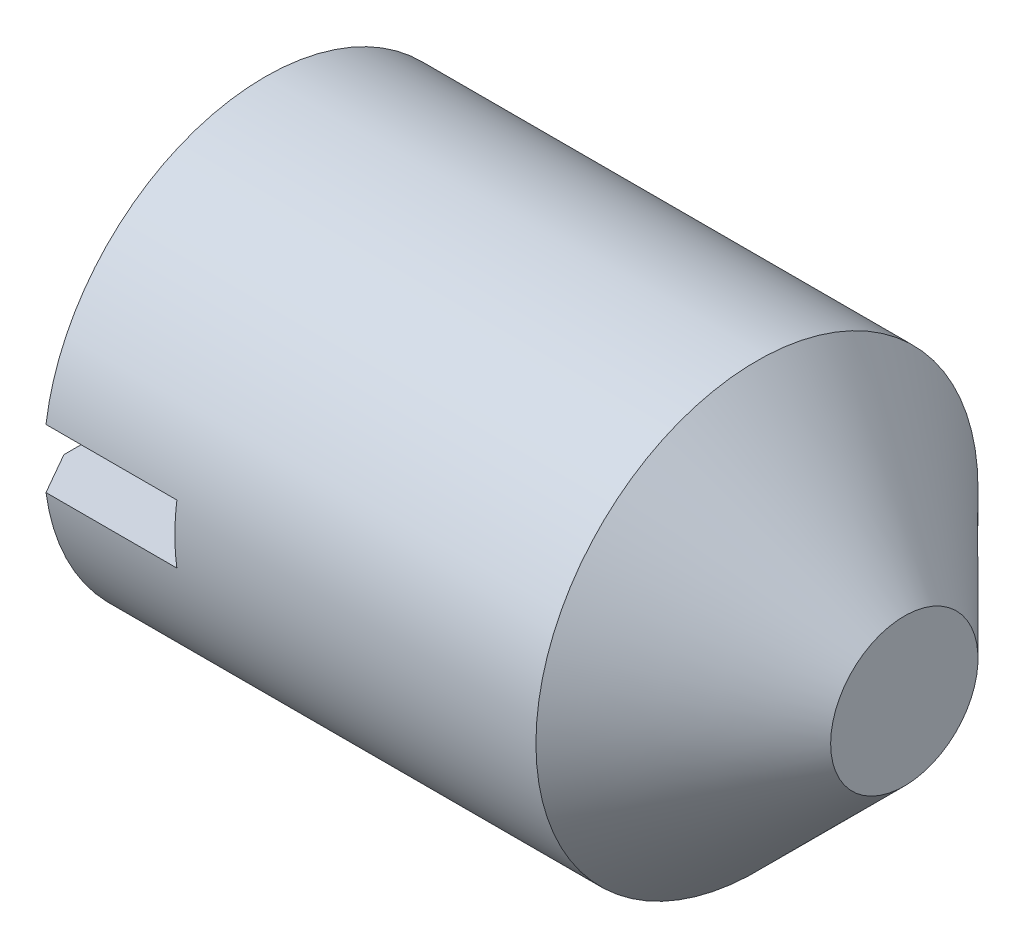
ISO-10303-21;
HEADER;
FILE_DESCRIPTION(('STEP AP214'),'2;1');
FILE_NAME('part.step','',(''),(''),'','','');
FILE_SCHEMA(('AUTOMOTIVE_DESIGN { 1 0 10303 214 1 1 1 1 }'));
ENDSEC;
DATA;
#1=APPLICATION_CONTEXT('core data for automotive mechanical design processes');
#2=APPLICATION_PROTOCOL_DEFINITION('international standard','automotive_design',2000,#1);
#3=PRODUCT_CONTEXT('',#1,'mechanical');
#4=PRODUCT('Part','Part','',(#3));
#5=PRODUCT_RELATED_PRODUCT_CATEGORY('part','',(#4));
#6=PRODUCT_DEFINITION_FORMATION('','',#4);
#7=PRODUCT_DEFINITION_CONTEXT('part definition',#1,'design');
#8=PRODUCT_DEFINITION('design','',#6,#7);
#9=PRODUCT_DEFINITION_SHAPE('','',#8);
#10=(LENGTH_UNIT() NAMED_UNIT(*) SI_UNIT(.MILLI.,.METRE.));
#11=(NAMED_UNIT(*) PLANE_ANGLE_UNIT() SI_UNIT($,.RADIAN.));
#12=(NAMED_UNIT(*) SI_UNIT($,.STERADIAN.) SOLID_ANGLE_UNIT());
#13=UNCERTAINTY_MEASURE_WITH_UNIT(LENGTH_MEASURE(1.E-05),#10,'distance_accuracy_value','');
#14=(GEOMETRIC_REPRESENTATION_CONTEXT(3) GLOBAL_UNCERTAINTY_ASSIGNED_CONTEXT((#13)) GLOBAL_UNIT_ASSIGNED_CONTEXT((#10,
#11,#12)) REPRESENTATION_CONTEXT('',''));
#15=CARTESIAN_POINT('',(0.,0.,0.));
#16=DIRECTION('',(0.,0.,1.));
#17=DIRECTION('',(1.,0.,0.));
#18=AXIS2_PLACEMENT_3D('',#15,#16,#17);
#19=CARTESIAN_POINT('',(0.,0.,0.));
#20=DIRECTION('',(-1.,0.,0.));
#21=DIRECTION('',(0.,0.,1.));
#22=AXIS2_PLACEMENT_3D('',#19,#20,#21);
#23=PLANE('',#22);
#24=CARTESIAN_POINT('',(0.,0.,0.));
#25=DIRECTION('',(-1.,0.,0.));
#26=DIRECTION('',(0.,0.,1.));
#27=AXIS2_PLACEMENT_3D('',#24,#25,#26);
#28=CIRCLE('',#27,1.2195);
#29=CARTESIAN_POINT('',(0.,-0.2,-1.20298805064722));
#30=VERTEX_POINT('',#29);
#31=CARTESIAN_POINT('',(0.,-0.2,1.20298805064722));
#32=VERTEX_POINT('',#31);
#33=EDGE_CURVE('E158',#30,#32,#28,.T.);
#34=ORIENTED_EDGE('',*,*,#33,.T.);
#35=DIRECTION('',(0.,0.,-1.));
#36=VECTOR('',#35,1.);
#37=CARTESIAN_POINT('',(0.,-0.2,1.5));
#38=LINE('',#37,#36);
#39=EDGE_CURVE('E113',#32,#30,#38,.T.);
#40=ORIENTED_EDGE('',*,*,#39,.T.);
#41=EDGE_LOOP('',(#34,#40));
#42=FACE_BOUND('',#41,.T.);
#43=ADVANCED_FACE('F37',(#42),#23,.T.);
#44=CARTESIAN_POINT('',(0.,0.,0.));
#45=DIRECTION('',(1.,0.,0.));
#46=DIRECTION('',(0.,0.,-1.));
#47=AXIS2_PLACEMENT_3D('',#44,#45,#46);
#48=CONICAL_SURFACE('',#47,1.2195,1.0471975511966);
#49=CARTESIAN_POINT('',(0.161946750507689,0.,0.));
#50=DIRECTION('',(-1.,0.,0.));
#51=DIRECTION('',(0.,0.,1.));
#52=AXIS2_PLACEMENT_3D('',#49,#50,#51);
#53=CIRCLE('',#52,1.5);
#54=CARTESIAN_POINT('',(0.161946750507689,-0.2,-1.48660687473185));
#55=VERTEX_POINT('',#54);
#56=CARTESIAN_POINT('',(0.161946750507689,-0.2,1.48660687473185));
#57=VERTEX_POINT('',#56);
#58=EDGE_CURVE('E163',#55,#57,#53,.T.);
#59=ORIENTED_EDGE('',*,*,#58,.T.);
#60=CARTESIAN_POINT('',(1.20629871080809,-0.2,3.30282076710549));
#61=CARTESIAN_POINT('',(1.1258848340686,-0.2,3.16328868098317));
#62=CARTESIAN_POINT('',(1.04548683646851,-0.2,3.02374748435471));
#63=CARTESIAN_POINT('',(0.884734685695384,-0.2,2.74464220536906));
#64=CARTESIAN_POINT('',(0.804380531977208,-0.2,2.60507812332584));
#65=CARTESIAN_POINT('',(0.563532322366071,-0.2,2.18657107206695));
#66=CARTESIAN_POINT('',(0.403118911408213,-0.2,1.90758155197264));
#67=CARTESIAN_POINT('',(0.203453091691774,-0.2,1.5591352689348));
#68=CARTESIAN_POINT('',(0.163813882961552,-0.2,1.48990028566118));
#69=CARTESIAN_POINT('',(0.0846214376710577,-0.2,1.35138417690048));
#70=CARTESIAN_POINT('',(0.045068198345437,-0.2,1.28210305299411));
#71=CARTESIAN_POINT('',(-0.0339277829048346,-0.2,1.14343154297904));
#72=CARTESIAN_POINT('',(-0.0733704592736069,-0.2,1.07404111944853));
#73=CARTESIAN_POINT('',(-0.15203026909522,-0.2,0.935122728971882));
#74=CARTESIAN_POINT('',(-0.191247377446437,-0.2,0.865594747832418));
#75=CARTESIAN_POINT('',(-0.269243442471656,-0.2,0.726327139109901));
#76=CARTESIAN_POINT('',(-0.308022564599071,-0.2,0.656587604996075));
#77=CARTESIAN_POINT('',(-0.365406927388352,-0.2,0.551558419317487));
#78=CARTESIAN_POINT('',(-0.384402406747344,-0.2,0.516482354594956));
#79=CARTESIAN_POINT('',(-0.421939923343245,-0.2,0.446089095801925));
#80=CARTESIAN_POINT('',(-0.440481991858611,-0.2,0.410771918580754));
#81=CARTESIAN_POINT('',(-0.467570677276347,-0.2,0.357595954007422));
#82=CARTESIAN_POINT('',(-0.476446721470345,-0.2,0.339905715546129));
#83=CARTESIAN_POINT('',(-0.493880874270408,-0.2,0.304364854504957));
#84=CARTESIAN_POINT('',(-0.502438924314328,-0.2,0.286514203127592));
#85=CARTESIAN_POINT('',(-0.519111988348972,-0.2,0.250508624654329));
#86=CARTESIAN_POINT('',(-0.527224910669282,-0.2,0.232352711011916));
#87=CARTESIAN_POINT('',(-0.54267790480467,-0.2,0.19572240226908));
#88=CARTESIAN_POINT('',(-0.550018195419213,-0.2,0.177248099066487));
#89=CARTESIAN_POINT('',(-0.565098059089181,-0.2,0.135214956292505));
#90=CARTESIAN_POINT('',(-0.572493338222675,-0.2,0.111521210196341));
#91=CARTESIAN_POINT('',(-0.580822315665492,-0.2,0.07545910853772));
#92=CARTESIAN_POINT('',(-0.583132873034638,-0.2,0.0634171537683038));
#93=CARTESIAN_POINT('',(-0.586609682213143,-0.2,0.0391732027075515));
#94=CARTESIAN_POINT('',(-0.587776935636715,-0.2,0.0269713560082879));
#95=CARTESIAN_POINT('',(-0.588820399014832,-0.2,0.00235568432887118));
#96=CARTESIAN_POINT('',(-0.588680137589163,-0.2,-0.010058873041522));
#97=CARTESIAN_POINT('',(-0.587089134244066,-0.2,-0.0348030961807394));
#98=CARTESIAN_POINT('',(-0.585638036534471,-0.2,-0.0471327379860356));
#99=CARTESIAN_POINT('',(-0.58159657218101,-0.2,-0.0717422859516815));
#100=CARTESIAN_POINT('',(-0.578993313922486,-0.2,-0.0840199950000165));
#101=CARTESIAN_POINT('',(-0.572904496311251,-0.2,-0.108351491101818));
#102=CARTESIAN_POINT('',(-0.569418710259527,-0.2,-0.120405219765151));
#103=CARTESIAN_POINT('',(-0.558447756238564,-0.2,-0.154857563867093));
#104=CARTESIAN_POINT('',(-0.550148968967213,-0.2,-0.17699252479426));
#105=CARTESIAN_POINT('',(-0.532322566219249,-0.2,-0.220768284226168));
#106=CARTESIAN_POINT('',(-0.522793484124285,-0.2,-0.242408456061966));
#107=CARTESIAN_POINT('',(-0.503003702579483,-0.2,-0.285415171147094));
#108=CARTESIAN_POINT('',(-0.492741238236355,-0.2,-0.306780897636912));
#109=CARTESIAN_POINT('',(-0.471779741367672,-0.2,-0.349298039322649));
#110=CARTESIAN_POINT('',(-0.461080654322906,-0.2,-0.370449427340883));
#111=CARTESIAN_POINT('',(-0.428496574582122,-0.2,-0.433836679537895));
#112=CARTESIAN_POINT('',(-0.406195821669475,-0.2,-0.475858043428755));
#113=CARTESIAN_POINT('',(-0.361115816189636,-0.2,-0.559540216113808));
#114=CARTESIAN_POINT('',(-0.338337517348818,-0.2,-0.601201545247628));
#115=CARTESIAN_POINT('',(-0.270113974050485,-0.2,-0.724978344281511));
#116=CARTESIAN_POINT('',(-0.224257059193257,-0.2,-0.806866708769459));
#117=CARTESIAN_POINT('',(-0.13212296028641,-0.2,-0.970408279374785));
#118=CARTESIAN_POINT('',(-0.0858457617209846,-0.2,-1.05206147724068));
#119=CARTESIAN_POINT('',(0.00696526589570302,-0.2,-1.21530054146956));
#120=CARTESIAN_POINT('',(0.0534992567625489,-0.2,-1.29688631601694));
#121=CARTESIAN_POINT('',(0.146690772784196,-0.2,-1.45998572685143));
#122=CARTESIAN_POINT('',(0.193348296331444,-0.2,-1.54149936405903));
#123=CARTESIAN_POINT('',(0.333088075414018,-0.2,-1.7853708564847));
#124=CARTESIAN_POINT('',(0.426282731775801,-0.2,-1.94766431380805));
#125=CARTESIAN_POINT('',(0.612788531876208,-0.2,-2.27214409768562));
#126=CARTESIAN_POINT('',(0.706099650769755,-0.2,-2.43433043853729));
#127=CARTESIAN_POINT('',(0.833307210297042,-0.2,-2.6553127645961));
#128=CARTESIAN_POINT('',(0.867170527933347,-0.200000000000001,-2.71412781150969));
#129=CARTESIAN_POINT('',(0.934906863459935,-0.200000000000001,-2.8317553866576));
#130=CARTESIAN_POINT('',(0.968779881678241,-0.200000000000001,-2.89056791470299));
#131=CARTESIAN_POINT('',(1.03659117667008,-0.200000000000001,-3.00829025510179));
#132=CARTESIAN_POINT('',(1.07052946537539,-0.200000000000001,-3.06720006058222));
#133=CARTESIAN_POINT('',(1.13841060073561,-0.200000000000001,-3.18501396406719));
#134=CARTESIAN_POINT('',(1.17235344715919,-0.200000000000001,-3.24391806220502));
#135=CARTESIAN_POINT('',(1.20629871080809,-0.200000000000001,-3.30282076710549));
#136=B_SPLINE_CURVE_WITH_KNOTS('',3,(#60,#61,#62,#63,#64,#65,#66,#67,#68,#69,#70,#71,#72,#73,
#74,#75,#76,#77,#78,#79,#80,#81,#82,#83,#84,#85,#86,#87,#88,#89,#90,#91,#92,#93,#94,#95,#96,#97,
#98,#99,#100,#101,#102,#103,#104,#105,#106,#107,#108,#109,#110,#111,#112,#113,#114,#115,#116,
#117,#118,#119,#120,#121,#122,#123,#124,#125,#126,#127,#128,#129,#130,#131,#132,#133,#134,#135),
.UNSPECIFIED.,.F.,.F.,(4,2,2,2,2,2,2,2,2,2,2,2,2,2,2,2,2,2,2,2,2,2,2,2,2,2,2,2,2,2,2,2,2,2,2,2,
2,4),(0.,0.483135881915182,0.966265613214854,1.93172257219434,2.17106066670211,2.41039094505958,
2.64984155615903,2.88931831730882,3.12870136566746,3.24836817227011,3.36802670025883,
3.42740075919355,3.48678569886581,3.5464292526316,3.6060558704016,3.68031927125071,
3.7170606614476,3.75376983475058,3.79094206959469,3.82812439684383,3.86573371330642,
3.90335270046815,3.97418935604331,4.04511124851304,4.11620996946988,4.18731759554776,
4.33002406930204,4.47246852696984,4.7540250366574,5.03559130803863,5.31736183818689,
5.5991287194502,6.16057277780873,6.72191257749192,6.92551367152995,7.12912274116123,
7.33308242695802,7.5370341031328),.UNSPECIFIED.);
#137=EDGE_CURVE('E58',#57,#32,#136,.T.);
#138=ORIENTED_EDGE('',*,*,#137,.T.);
#139=ORIENTED_EDGE('',*,*,#33,.F.);
#140=EDGE_CURVE('E169',#30,#55,#136,.T.);
#141=ORIENTED_EDGE('',*,*,#140,.T.);
#142=EDGE_LOOP('',(#59,#138,#139,#141));
#143=FACE_BOUND('',#142,.T.);
#144=ADVANCED_FACE('F142',(#143),#48,.T.);
#145=CARTESIAN_POINT('',(-12.7,0.,0.));
#146=DIRECTION('',(-1.,0.,0.));
#147=DIRECTION('',(0.,0.,1.));
#148=AXIS2_PLACEMENT_3D('',#145,#146,#147);
#149=CYLINDRICAL_SURFACE('',#148,1.5);
#150=CARTESIAN_POINT('',(3.5,0.,0.));
#151=DIRECTION('',(-1.,0.,0.));
#152=DIRECTION('',(0.,0.,1.));
#153=AXIS2_PLACEMENT_3D('',#150,#151,#152);
#154=CIRCLE('',#153,1.5);
#155=CARTESIAN_POINT('',(3.5,0.,1.5));
#156=VERTEX_POINT('',#155);
#157=EDGE_CURVE('E168',#156,#156,#154,.T.);
#158=ORIENTED_EDGE('',*,*,#157,.T.);
#159=EDGE_LOOP('',(#158));
#160=FACE_BOUND('',#159,.T.);
#161=ORIENTED_EDGE('',*,*,#58,.F.);
#162=DIRECTION('',(-1.,0.,0.));
#163=VECTOR('',#162,1.);
#164=CARTESIAN_POINT('',(-12.7,-0.2,-1.48660687473185));
#165=LINE('',#164,#163);
#166=CARTESIAN_POINT('',(1.05,-0.2,-1.48660687473185));
#167=VERTEX_POINT('',#166);
#168=EDGE_CURVE('E11',#55,#167,#165,.F.);
#169=ORIENTED_EDGE('',*,*,#168,.T.);
#170=CARTESIAN_POINT('',(1.05,0.,0.));
#171=DIRECTION('',(-1.,0.,0.));
#172=DIRECTION('',(0.,0.,1.));
#173=AXIS2_PLACEMENT_3D('',#170,#171,#172);
#174=CIRCLE('',#173,1.5);
#175=CARTESIAN_POINT('',(1.05,0.2,-1.48660687473185));
#176=VERTEX_POINT('',#175);
#177=EDGE_CURVE('E102',#167,#176,#174,.F.);
#178=ORIENTED_EDGE('',*,*,#177,.T.);
#179=DIRECTION('',(-1.,0.,0.));
#180=VECTOR('',#179,1.);
#181=CARTESIAN_POINT('',(-12.7,0.2,-1.48660687473185));
#182=LINE('',#181,#180);
#183=CARTESIAN_POINT('',(0.161946750507689,0.2,-1.48660687473185));
#184=VERTEX_POINT('',#183);
#185=EDGE_CURVE('E46',#184,#176,#182,.F.);
#186=ORIENTED_EDGE('',*,*,#185,.F.);
#187=CARTESIAN_POINT('',(0.161946750507689,0.2,1.48660687473185));
#188=VERTEX_POINT('',#187);
#189=EDGE_CURVE('E159',#188,#184,#53,.T.);
#190=ORIENTED_EDGE('',*,*,#189,.F.);
#191=DIRECTION('',(-1.,0.,0.));
#192=VECTOR('',#191,1.);
#193=CARTESIAN_POINT('',(-12.7,0.2,1.48660687473185));
#194=LINE('',#193,#192);
#195=CARTESIAN_POINT('',(1.05,0.2,1.48660687473185));
#196=VERTEX_POINT('',#195);
#197=EDGE_CURVE('E95',#196,#188,#194,.T.);
#198=ORIENTED_EDGE('',*,*,#197,.F.);
#199=CARTESIAN_POINT('',(1.05,-0.2,1.48660687473185));
#200=VERTEX_POINT('',#199);
#201=EDGE_CURVE('E89',#196,#200,#174,.F.);
#202=ORIENTED_EDGE('',*,*,#201,.T.);
#203=DIRECTION('',(-1.,0.,0.));
#204=VECTOR('',#203,1.);
#205=CARTESIAN_POINT('',(-12.7,-0.2,1.48660687473185));
#206=LINE('',#205,#204);
#207=EDGE_CURVE('E92',#200,#57,#206,.T.);
#208=ORIENTED_EDGE('',*,*,#207,.T.);
#209=EDGE_LOOP('',(#161,#169,#178,#186,#190,#198,#202,#208));
#210=FACE_BOUND('',#209,.T.);
#211=ADVANCED_FACE('F91',(#160,#210),#149,.T.);
#212=DIRECTION('',(0.,0.,-1.));
#213=VECTOR('',#212,1.);
#214=CARTESIAN_POINT('',(0.,0.2,1.5));
#215=LINE('',#214,#213);
#216=CARTESIAN_POINT('',(0.,0.2,1.20298805064722));
#217=VERTEX_POINT('',#216);
#218=CARTESIAN_POINT('',(0.,0.2,-1.20298805064722));
#219=VERTEX_POINT('',#218);
#220=EDGE_CURVE('E173',#217,#219,#215,.T.);
#221=ORIENTED_EDGE('',*,*,#220,.F.);
#222=EDGE_CURVE('E100',#217,#219,#28,.T.);
#223=ORIENTED_EDGE('',*,*,#222,.T.);
#224=EDGE_LOOP('',(#221,#223));
#225=FACE_BOUND('',#224,.T.);
#226=ADVANCED_FACE('F39',(#225),#23,.T.);
#227=CARTESIAN_POINT('',(1.20629871080809,0.2,3.30282076710549));
#228=CARTESIAN_POINT('',(1.1258848340686,0.2,3.16328868098317));
#229=CARTESIAN_POINT('',(1.04548683646851,0.2,3.02374748435471));
#230=CARTESIAN_POINT('',(0.884734685695383,0.2,2.74464220536906));
#231=CARTESIAN_POINT('',(0.804380531977208,0.2,2.60507812332584));
#232=CARTESIAN_POINT('',(0.563532322366071,0.2,2.18657107206695));
#233=CARTESIAN_POINT('',(0.403118911408213,0.2,1.90758155197264));
#234=CARTESIAN_POINT('',(0.203453091691774,0.2,1.5591352689348));
#235=CARTESIAN_POINT('',(0.163813882961552,0.2,1.48990028566118));
#236=CARTESIAN_POINT('',(0.0846214376710577,0.2,1.35138417690048));
#237=CARTESIAN_POINT('',(0.0450681983454369,0.2,1.28210305299411));
#238=CARTESIAN_POINT('',(-0.0339277829048347,0.2,1.14343154297904));
#239=CARTESIAN_POINT('',(-0.073370459273607,0.2,1.07404111944853));
#240=CARTESIAN_POINT('',(-0.152030269095221,0.2,0.935122728971882));
#241=CARTESIAN_POINT('',(-0.191247377446437,0.2,0.865594747832418));
#242=CARTESIAN_POINT('',(-0.269243442471656,0.2,0.726327139109901));
#243=CARTESIAN_POINT('',(-0.308022564599072,0.2,0.656587604996075));
#244=CARTESIAN_POINT('',(-0.365406927388352,0.2,0.551558419317487));
#245=CARTESIAN_POINT('',(-0.384402406747345,0.2,0.516482354594956));
#246=CARTESIAN_POINT('',(-0.421939923343245,0.2,0.446089095801925));
#247=CARTESIAN_POINT('',(-0.440481991858611,0.2,0.410771918580754));
#248=CARTESIAN_POINT('',(-0.467570677276347,0.2,0.357595954007422));
#249=CARTESIAN_POINT('',(-0.476446721470345,0.2,0.339905715546129));
#250=CARTESIAN_POINT('',(-0.493880874270408,0.2,0.304364854504957));
#251=CARTESIAN_POINT('',(-0.502438924314328,0.2,0.286514203127592));
#252=CARTESIAN_POINT('',(-0.519111988348972,0.2,0.250508624654329));
#253=CARTESIAN_POINT('',(-0.527224910669282,0.2,0.232352711011916));
#254=CARTESIAN_POINT('',(-0.54267790480467,0.2,0.19572240226908));
#255=CARTESIAN_POINT('',(-0.550018195419213,0.2,0.177248099066487));
#256=CARTESIAN_POINT('',(-0.565098059089181,0.2,0.135214956292505));
#257=CARTESIAN_POINT('',(-0.572493338222675,0.2,0.111521210196341));
#258=CARTESIAN_POINT('',(-0.580822315665493,0.2,0.0754591085377203));
#259=CARTESIAN_POINT('',(-0.583132873034638,0.2,0.0634171537683041));
#260=CARTESIAN_POINT('',(-0.586609682213143,0.2,0.0391732027075519));
#261=CARTESIAN_POINT('',(-0.587776935636715,0.2,0.0269713560082882));
#262=CARTESIAN_POINT('',(-0.588820399014832,0.2,0.00235568432887132));
#263=CARTESIAN_POINT('',(-0.588680137589163,0.2,-0.010058873041522));
#264=CARTESIAN_POINT('',(-0.587089134244066,0.2,-0.0348030961807394));
#265=CARTESIAN_POINT('',(-0.585638036534471,0.2,-0.0471327379860355));
#266=CARTESIAN_POINT('',(-0.581596572181011,0.2,-0.0717422859516812));
#267=CARTESIAN_POINT('',(-0.578993313922486,0.2,-0.0840199950000163));
#268=CARTESIAN_POINT('',(-0.572904496311251,0.2,-0.108351491101818));
#269=CARTESIAN_POINT('',(-0.569418710259527,0.2,-0.120405219765151));
#270=CARTESIAN_POINT('',(-0.558447756238564,0.2,-0.154857563867093));
#271=CARTESIAN_POINT('',(-0.550148968967213,0.2,-0.17699252479426));
#272=CARTESIAN_POINT('',(-0.532322566219249,0.2,-0.220768284226168));
#273=CARTESIAN_POINT('',(-0.522793484124285,0.2,-0.242408456061966));
#274=CARTESIAN_POINT('',(-0.503003702579483,0.2,-0.285415171147093));
#275=CARTESIAN_POINT('',(-0.492741238236356,0.2,-0.306780897636911));
#276=CARTESIAN_POINT('',(-0.471779741367673,0.2,-0.349298039322648));
#277=CARTESIAN_POINT('',(-0.461080654322907,0.2,-0.370449427340882));
#278=CARTESIAN_POINT('',(-0.428496574582123,0.2,-0.433836679537894));
#279=CARTESIAN_POINT('',(-0.406195821669476,0.2,-0.475858043428754));
#280=CARTESIAN_POINT('',(-0.361115816189637,0.2,-0.559540216113806));
#281=CARTESIAN_POINT('',(-0.338337517348819,0.2,-0.601201545247626));
#282=CARTESIAN_POINT('',(-0.270113974050486,0.2,-0.724978344281508));
#283=CARTESIAN_POINT('',(-0.224257059193259,0.2,-0.806866708769456));
#284=CARTESIAN_POINT('',(-0.132122960286412,0.2,-0.970408279374782));
#285=CARTESIAN_POINT('',(-0.085845761720987,0.2,-1.05206147724068));
#286=CARTESIAN_POINT('',(0.00696526589570022,0.2,-1.21530054146955));
#287=CARTESIAN_POINT('',(0.0534992567625459,0.2,-1.29688631601694));
#288=CARTESIAN_POINT('',(0.146690772784193,0.2,-1.45998572685142));
#289=CARTESIAN_POINT('',(0.19334829633144,0.2,-1.54149936405902));
#290=CARTESIAN_POINT('',(0.333088075414013,0.2,-1.78537085648469));
#291=CARTESIAN_POINT('',(0.426282731775796,0.2,-1.94766431380804));
#292=CARTESIAN_POINT('',(0.612788531876202,0.2,-2.27214409768561));
#293=CARTESIAN_POINT('',(0.706099650769749,0.2,-2.43433043853728));
#294=CARTESIAN_POINT('',(0.833307210297036,0.2,-2.65531276459609));
#295=CARTESIAN_POINT('',(0.867170527933341,0.2,-2.71412781150968));
#296=CARTESIAN_POINT('',(0.934906863459931,0.2,-2.83175538665759));
#297=CARTESIAN_POINT('',(0.968779881678237,0.2,-2.89056791470298));
#298=CARTESIAN_POINT('',(1.03659117667008,0.2,-3.00829025510178));
#299=CARTESIAN_POINT('',(1.07052946537539,0.2,-3.06720006058222));
#300=CARTESIAN_POINT('',(1.13841060073561,0.2,-3.18501396406719));
#301=CARTESIAN_POINT('',(1.17235344715918,0.2,-3.24391806220502));
#302=CARTESIAN_POINT('',(1.20629871080809,0.2,-3.30282076710549));
#303=B_SPLINE_CURVE_WITH_KNOTS('',3,(#227,#228,#229,#230,#231,#232,#233,#234,#235,#236,#237,
#238,#239,#240,#241,#242,#243,#244,#245,#246,#247,#248,#249,#250,#251,#252,#253,#254,#255,#256,
#257,#258,#259,#260,#261,#262,#263,#264,#265,#266,#267,#268,#269,#270,#271,#272,#273,#274,#275,
#276,#277,#278,#279,#280,#281,#282,#283,#284,#285,#286,#287,#288,#289,#290,#291,#292,#293,#294,
#295,#296,#297,#298,#299,#300,#301,#302),.UNSPECIFIED.,.F.,.F.,(4,2,2,2,2,2,2,2,2,2,2,2,2,2,2,2,
2,2,2,2,2,2,2,2,2,2,2,2,2,2,2,2,2,2,2,2,2,4),(0.,0.483135881915183,0.966265613214855,
1.93172257219434,2.17106066670211,2.41039094505958,2.64984155615903,2.88931831730882,
3.12870136566746,3.24836817227011,3.36802670025883,3.42740075919355,3.48678569886581,
3.5464292526316,3.6060558704016,3.68031927125071,3.71706066144759,3.75376983475058,
3.79094206959469,3.82812439684383,3.86573371330642,3.90335270046815,3.97418935604331,
4.04511124851304,4.11620996946988,4.18731759554776,4.33002406930204,4.47246852696984,
4.75402503665739,5.03559130803862,5.31736183818689,5.59912871945019,6.16057277780872,
6.72191257749191,6.92551367152994,7.12912274116122,7.33308242695801,7.5370341031328),.UNSPECIFIED.);
#304=EDGE_CURVE('E108',#188,#217,#303,.T.);
#305=ORIENTED_EDGE('',*,*,#304,.F.);
#306=ORIENTED_EDGE('',*,*,#189,.T.);
#307=EDGE_CURVE('E111',#219,#184,#303,.T.);
#308=ORIENTED_EDGE('',*,*,#307,.F.);
#309=ORIENTED_EDGE('',*,*,#222,.F.);
#310=EDGE_LOOP('',(#305,#306,#308,#309));
#311=FACE_BOUND('',#310,.T.);
#312=ADVANCED_FACE('F128',(#311),#48,.T.);
#313=CARTESIAN_POINT('',(3.5,0.,0.));
#314=DIRECTION('',(-1.,0.,0.));
#315=DIRECTION('',(0.,0.,1.));
#316=AXIS2_PLACEMENT_3D('',#313,#314,#315);
#317=CONICAL_SURFACE('',#316,1.5,0.78539816339745);
#318=CARTESIAN_POINT('',(4.5,0.,0.));
#319=DIRECTION('',(-1.,0.,0.));
#320=DIRECTION('',(0.,0.,1.));
#321=AXIS2_PLACEMENT_3D('',#318,#319,#320);
#322=CIRCLE('',#321,0.500000000000001);
#323=CARTESIAN_POINT('',(4.5,0.,0.5));
#324=VERTEX_POINT('',#323);
#325=EDGE_CURVE('E41',#324,#324,#322,.F.);
#326=CARTESIAN_POINT('',(4.5,0.,0.5));
#327=CARTESIAN_POINT('',(4.48958333333333,0.,0.510416666666667));
#328=CARTESIAN_POINT('',(4.47916666666667,0.,0.520833333333333));
#329=CARTESIAN_POINT('',(4.45833333333333,0.,0.541666666666667));
#330=CARTESIAN_POINT('',(4.44791666666667,0.,0.552083333333333));
#331=CARTESIAN_POINT('',(4.42708333333333,0.,0.572916666666666));
#332=CARTESIAN_POINT('',(4.41666666666667,0.,0.583333333333333));
#333=CARTESIAN_POINT('',(4.39583333333333,0.,0.604166666666667));
#334=CARTESIAN_POINT('',(4.38541666666667,0.,0.614583333333333));
#335=CARTESIAN_POINT('',(4.36458333333333,0.,0.635416666666666));
#336=CARTESIAN_POINT('',(4.35416666666667,0.,0.645833333333333));
#337=CARTESIAN_POINT('',(4.33333333333333,0.,0.666666666666666));
#338=CARTESIAN_POINT('',(4.32291666666667,0.,0.677083333333333));
#339=CARTESIAN_POINT('',(4.30208333333333,0.,0.697916666666667));
#340=CARTESIAN_POINT('',(4.29166666666667,0.,0.708333333333333));
#341=CARTESIAN_POINT('',(4.27083333333333,0.,0.729166666666666));
#342=CARTESIAN_POINT('',(4.26041666666667,0.,0.739583333333333));
#343=CARTESIAN_POINT('',(4.23958333333333,0.,0.760416666666666));
#344=CARTESIAN_POINT('',(4.22916666666667,0.,0.770833333333333));
#345=CARTESIAN_POINT('',(4.20833333333333,0.,0.791666666666666));
#346=CARTESIAN_POINT('',(4.19791666666667,0.,0.802083333333333));
#347=CARTESIAN_POINT('',(4.17708333333333,0.,0.822916666666666));
#348=CARTESIAN_POINT('',(4.16666666666667,0.,0.833333333333333));
#349=CARTESIAN_POINT('',(4.14583333333333,0.,0.854166666666666));
#350=CARTESIAN_POINT('',(4.13541666666667,0.,0.864583333333333));
#351=CARTESIAN_POINT('',(4.11458333333333,0.,0.885416666666667));
#352=CARTESIAN_POINT('',(4.10416666666667,0.,0.895833333333333));
#353=CARTESIAN_POINT('',(4.08333333333333,0.,0.916666666666666));
#354=CARTESIAN_POINT('',(4.07291666666667,0.,0.927083333333333));
#355=CARTESIAN_POINT('',(4.05208333333333,0.,0.947916666666666));
#356=CARTESIAN_POINT('',(4.04166666666667,0.,0.958333333333333));
#357=CARTESIAN_POINT('',(4.02083333333333,0.,0.979166666666666));
#358=CARTESIAN_POINT('',(4.01041666666667,0.,0.989583333333333));
#359=CARTESIAN_POINT('',(3.98958333333333,0.,1.01041666666667));
#360=CARTESIAN_POINT('',(3.97916666666667,0.,1.02083333333333));
#361=CARTESIAN_POINT('',(3.95833333333334,0.,1.04166666666667));
#362=CARTESIAN_POINT('',(3.94791666666667,0.,1.05208333333333));
#363=CARTESIAN_POINT('',(3.92708333333334,0.,1.07291666666667));
#364=CARTESIAN_POINT('',(3.91666666666667,0.,1.08333333333333));
#365=CARTESIAN_POINT('',(3.89583333333333,0.,1.10416666666667));
#366=CARTESIAN_POINT('',(3.88541666666667,0.,1.11458333333333));
#367=CARTESIAN_POINT('',(3.86458333333333,0.,1.13541666666667));
#368=CARTESIAN_POINT('',(3.85416666666667,0.,1.14583333333333));
#369=CARTESIAN_POINT('',(3.83333333333334,0.,1.16666666666667));
#370=CARTESIAN_POINT('',(3.82291666666667,0.,1.17708333333333));
#371=CARTESIAN_POINT('',(3.80208333333334,0.,1.19791666666667));
#372=CARTESIAN_POINT('',(3.79166666666667,0.,1.20833333333333));
#373=CARTESIAN_POINT('',(3.77083333333334,0.,1.22916666666667));
#374=CARTESIAN_POINT('',(3.76041666666667,0.,1.23958333333333));
#375=CARTESIAN_POINT('',(3.73958333333334,0.,1.26041666666667));
#376=CARTESIAN_POINT('',(3.72916666666667,0.,1.27083333333333));
#377=CARTESIAN_POINT('',(3.70833333333334,0.,1.29166666666667));
#378=CARTESIAN_POINT('',(3.69791666666667,0.,1.30208333333333));
#379=CARTESIAN_POINT('',(3.67708333333334,0.,1.32291666666667));
#380=CARTESIAN_POINT('',(3.66666666666667,0.,1.33333333333333));
#381=CARTESIAN_POINT('',(3.64583333333334,0.,1.35416666666667));
#382=CARTESIAN_POINT('',(3.63541666666667,0.,1.36458333333333));
#383=CARTESIAN_POINT('',(3.61458333333334,0.,1.38541666666667));
#384=CARTESIAN_POINT('',(3.60416666666667,0.,1.39583333333333));
#385=CARTESIAN_POINT('',(3.58333333333334,0.,1.41666666666667));
#386=CARTESIAN_POINT('',(3.57291666666667,0.,1.42708333333333));
#387=CARTESIAN_POINT('',(3.55208333333334,0.,1.44791666666667));
#388=CARTESIAN_POINT('',(3.54166666666667,0.,1.45833333333333));
#389=CARTESIAN_POINT('',(3.52083333333334,0.,1.47916666666667));
#390=CARTESIAN_POINT('',(3.51041666666667,0.,1.48958333333333));
#391=CARTESIAN_POINT('',(3.5,0.,1.5));
#392=B_SPLINE_CURVE_WITH_KNOTS('',3,(#326,#327,#328,#329,#330,#331,#332,#333,#334,#335,#336,
#337,#338,#339,#340,#341,#342,#343,#344,#345,#346,#347,#348,#349,#350,#351,#352,#353,#354,#355,
#356,#357,#358,#359,#360,#361,#362,#363,#364,#365,#366,#367,#368,#369,#370,#371,#372,#373,#374,
#375,#376,#377,#378,#379,#380,#381,#382,#383,#384,#385,#386,#387,#388,#389,#390,#391),
.UNSPECIFIED.,.F.,.F.,(4,2,2,2,2,2,2,2,2,2,2,2,2,2,2,2,2,2,2,2,2,2,2,2,2,2,2,2,2,2,2,2,4),(0.,
0.0441941738241586,0.0883883476483178,0.132582521472477,0.176776695296636,0.220970869120795,
0.265165042944954,0.309359216769113,0.353553390593272,0.397747564417432,0.441941738241591,
0.48613591206575,0.530330085889909,0.574524259714068,0.618718433538227,0.662912607362387,
0.707106781186546,0.751300955010704,0.795495128834864,0.839689302659023,0.883883476483182,
0.928077650307341,0.9722718241315,1.01646599795566,1.06066017177982,1.10485434560398,
1.14904851942814,1.1932426932523,1.23743686707645,1.28163104090061,1.32582521472477,
1.37001938854893,1.41421356237309),.UNSPECIFIED.);
#393=EDGE_CURVE('BSEAM138',#324,#156,#392,.T.);
#394=ORIENTED_EDGE('',*,*,#325,.F.);
#395=ORIENTED_EDGE('',*,*,#157,.F.);
#396=ORIENTED_EDGE('',*,*,#393,.T.);
#397=ORIENTED_EDGE('',*,*,#393,.F.);
#398=EDGE_LOOP('',(#394,#396,#395,#397));
#399=FACE_BOUND('',#398,.T.);
#400=ADVANCED_FACE('F138',(#399),#317,.T.);
#401=CARTESIAN_POINT('',(1.05,-0.2,1.5));
#402=DIRECTION('',(0.,1.,0.));
#403=DIRECTION('',(0.,0.,1.));
#404=AXIS2_PLACEMENT_3D('',#401,#402,#403);
#405=PLANE('',#404);
#406=ORIENTED_EDGE('',*,*,#39,.F.);
#407=ORIENTED_EDGE('',*,*,#137,.F.);
#408=ORIENTED_EDGE('',*,*,#207,.F.);
#409=DIRECTION('',(0.,0.,-1.));
#410=VECTOR('',#409,1.);
#411=CARTESIAN_POINT('',(1.05,-0.2,1.5));
#412=LINE('',#411,#410);
#413=EDGE_CURVE('E104',#200,#167,#412,.T.);
#414=ORIENTED_EDGE('',*,*,#413,.T.);
#415=ORIENTED_EDGE('',*,*,#168,.F.);
#416=ORIENTED_EDGE('',*,*,#140,.F.);
#417=EDGE_LOOP('',(#406,#407,#408,#414,#415,#416));
#418=FACE_BOUND('',#417,.T.);
#419=ADVANCED_FACE('F103',(#418),#405,.T.);
#420=CARTESIAN_POINT('',(1.05,0.2,1.5));
#421=DIRECTION('',(0.,1.,0.));
#422=DIRECTION('',(0.,0.,1.));
#423=AXIS2_PLACEMENT_3D('',#420,#421,#422);
#424=PLANE('',#423);
#425=ORIENTED_EDGE('',*,*,#307,.T.);
#426=ORIENTED_EDGE('',*,*,#185,.T.);
#427=DIRECTION('',(0.,0.,-1.));
#428=VECTOR('',#427,1.);
#429=CARTESIAN_POINT('',(1.05,0.2,1.5));
#430=LINE('',#429,#428);
#431=EDGE_CURVE('E109',#196,#176,#430,.T.);
#432=ORIENTED_EDGE('',*,*,#431,.F.);
#433=ORIENTED_EDGE('',*,*,#197,.T.);
#434=ORIENTED_EDGE('',*,*,#304,.T.);
#435=ORIENTED_EDGE('',*,*,#220,.T.);
#436=EDGE_LOOP('',(#425,#426,#432,#433,#434,#435));
#437=FACE_BOUND('',#436,.T.);
#438=ADVANCED_FACE('F131',(#437),#424,.F.);
#439=CARTESIAN_POINT('',(1.05,0.2,1.5));
#440=DIRECTION('',(-1.,0.,0.));
#441=DIRECTION('',(0.,0.,1.));
#442=AXIS2_PLACEMENT_3D('',#439,#440,#441);
#443=PLANE('',#442);
#444=ORIENTED_EDGE('',*,*,#413,.F.);
#445=ORIENTED_EDGE('',*,*,#201,.F.);
#446=ORIENTED_EDGE('',*,*,#431,.T.);
#447=ORIENTED_EDGE('',*,*,#177,.F.);
#448=EDGE_LOOP('',(#444,#445,#446,#447));
#449=FACE_BOUND('',#448,.T.);
#450=ADVANCED_FACE('F106',(#449),#443,.T.);
#451=CARTESIAN_POINT('',(4.5,-1.5,-0.889575289575289));
#452=DIRECTION('',(-1.,0.,0.));
#453=DIRECTION('',(0.,0.,1.));
#454=AXIS2_PLACEMENT_3D('',#451,#452,#453);
#455=PLANE('',#454);
#456=ORIENTED_EDGE('',*,*,#325,.T.);
#457=EDGE_LOOP('',(#456));
#458=FACE_BOUND('',#457,.T.);
#459=ADVANCED_FACE('F181',(#458),#455,.F.);
#460=CLOSED_SHELL('',(#43,#144,#211,#226,#312,#400,#419,#438,#450,#459));
#461=MANIFOLD_SOLID_BREP('B2',#460);
#462=ADVANCED_BREP_SHAPE_REPRESENTATION('',(#18,#461),#14);
#463=SHAPE_DEFINITION_REPRESENTATION(#9,#462);
ENDSEC;
END-ISO-10303-21;
